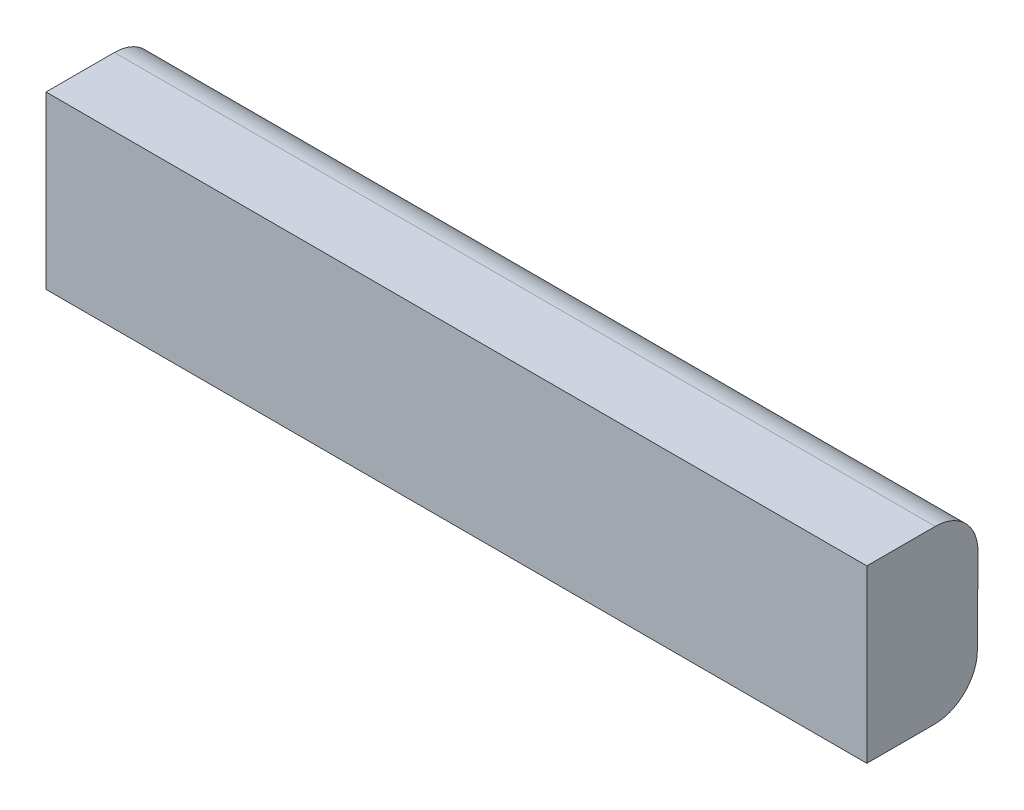
ISO-10303-21;
HEADER;
FILE_DESCRIPTION(('STEP AP214'),'2;1');
FILE_NAME('part.step','',(''),(''),'','','');
FILE_SCHEMA(('AUTOMOTIVE_DESIGN { 1 0 10303 214 1 1 1 1 }'));
ENDSEC;
DATA;
#1=APPLICATION_CONTEXT('core data for automotive mechanical design processes');
#2=APPLICATION_PROTOCOL_DEFINITION('international standard','automotive_design',2000,#1);
#3=PRODUCT_CONTEXT('',#1,'mechanical');
#4=PRODUCT('Part','Part','',(#3));
#5=PRODUCT_RELATED_PRODUCT_CATEGORY('part','',(#4));
#6=PRODUCT_DEFINITION_FORMATION('','',#4);
#7=PRODUCT_DEFINITION_CONTEXT('part definition',#1,'design');
#8=PRODUCT_DEFINITION('design','',#6,#7);
#9=PRODUCT_DEFINITION_SHAPE('','',#8);
#10=(LENGTH_UNIT() NAMED_UNIT(*) SI_UNIT(.MILLI.,.METRE.));
#11=(NAMED_UNIT(*) PLANE_ANGLE_UNIT() SI_UNIT($,.RADIAN.));
#12=(NAMED_UNIT(*) SI_UNIT($,.STERADIAN.) SOLID_ANGLE_UNIT());
#13=UNCERTAINTY_MEASURE_WITH_UNIT(LENGTH_MEASURE(1.E-05),#10,'distance_accuracy_value','');
#14=(GEOMETRIC_REPRESENTATION_CONTEXT(3) GLOBAL_UNCERTAINTY_ASSIGNED_CONTEXT((#13)) GLOBAL_UNIT_ASSIGNED_CONTEXT((#10,
#11,#12)) REPRESENTATION_CONTEXT('',''));
#15=CARTESIAN_POINT('',(0.,0.,0.));
#16=DIRECTION('',(0.,0.,1.));
#17=DIRECTION('',(1.,0.,0.));
#18=AXIS2_PLACEMENT_3D('',#15,#16,#17);
#19=CARTESIAN_POINT('',(609.6,-11.0704388992199,17.6191479273626));
#20=DIRECTION('',(-1.,0.,0.));
#21=DIRECTION('',(0.,0.,1.));
#22=AXIS2_PLACEMENT_3D('',#19,#20,#21);
#23=CYLINDRICAL_SURFACE('',#22,31.75);
#24=CARTESIAN_POINT('',(0.,-11.0704388992199,17.6191479273626));
#25=DIRECTION('',(1.,0.,0.));
#26=DIRECTION('',(0.,0.,-1.));
#27=AXIS2_PLACEMENT_3D('',#24,#25,#26);
#28=CIRCLE('',#27,31.75);
#29=CARTESIAN_POINT('',(0.,-42.8204388992199,17.6191479273626));
#30=VERTEX_POINT('',#29);
#31=CARTESIAN_POINT('',(0.,-11.0704388992199,-14.1308520726374));
#32=VERTEX_POINT('',#31);
#33=EDGE_CURVE('E128',#30,#32,#28,.T.);
#34=ORIENTED_EDGE('',*,*,#33,.T.);
#35=DIRECTION('',(-1.,0.,0.));
#36=VECTOR('',#35,1.);
#37=CARTESIAN_POINT('',(609.6,-11.0704388992199,-14.1308520726374));
#38=LINE('',#37,#36);
#39=CARTESIAN_POINT('',(609.6,-11.0704388992199,-14.1308520726374));
#40=VERTEX_POINT('',#39);
#41=EDGE_CURVE('E11',#40,#32,#38,.T.);
#42=ORIENTED_EDGE('',*,*,#41,.F.);
#43=CARTESIAN_POINT('',(609.6,-11.0704388992199,17.6191479273626));
#44=DIRECTION('',(1.,0.,0.));
#45=DIRECTION('',(0.,0.,-1.));
#46=AXIS2_PLACEMENT_3D('',#43,#44,#45);
#47=CIRCLE('',#46,31.75);
#48=CARTESIAN_POINT('',(609.6,-42.8204388992199,17.6191479273626));
#49=VERTEX_POINT('',#48);
#50=EDGE_CURVE('E144',#49,#40,#47,.T.);
#51=ORIENTED_EDGE('',*,*,#50,.F.);
#52=DIRECTION('',(-1.,0.,0.));
#53=VECTOR('',#52,1.);
#54=CARTESIAN_POINT('',(609.6,-42.8204388992199,17.6191479273626));
#55=LINE('',#54,#53);
#56=EDGE_CURVE('E124',#49,#30,#55,.T.);
#57=ORIENTED_EDGE('',*,*,#56,.T.);
#58=EDGE_LOOP('',(#34,#42,#51,#57));
#59=FACE_BOUND('',#58,.T.);
#60=ADVANCED_FACE('F39',(#59),#23,.T.);
#61=CARTESIAN_POINT('',(609.6,52.4295611007801,-14.6077024444965));
#62=DIRECTION('',(0.,0.00750924294765673,0.999971805237704));
#63=DIRECTION('',(0.,-0.999971805237704,0.00750924294765673));
#64=AXIS2_PLACEMENT_3D('',#61,#62,#63);
#65=PLANE('',#64);
#66=DIRECTION('',(0.,0.999971805237704,-0.00750924294765673));
#67=VECTOR('',#66,1.);
#68=CARTESIAN_POINT('',(0.,52.4295611007801,-14.6077024444965));
#69=LINE('',#68,#67);
#70=CARTESIAN_POINT('',(0.,52.4295611007801,-14.6077024444965));
#71=VERTEX_POINT('',#70);
#72=EDGE_CURVE('E132',#32,#71,#69,.T.);
#73=ORIENTED_EDGE('',*,*,#72,.T.);
#74=DIRECTION('',(-1.,0.,0.));
#75=VECTOR('',#74,1.);
#76=CARTESIAN_POINT('',(609.6,52.4295611007801,-14.6077024444965));
#77=LINE('',#76,#75);
#78=CARTESIAN_POINT('',(609.6,52.4295611007801,-14.6077024444965));
#79=VERTEX_POINT('',#78);
#80=EDGE_CURVE('E48',#79,#71,#77,.T.);
#81=ORIENTED_EDGE('',*,*,#80,.F.);
#82=DIRECTION('',(0.,0.999971805237704,-0.00750924294765673));
#83=VECTOR('',#82,1.);
#84=CARTESIAN_POINT('',(609.6,52.4295611007801,-14.6077024444965));
#85=LINE('',#84,#83);
#86=EDGE_CURVE('E93',#40,#79,#85,.T.);
#87=ORIENTED_EDGE('',*,*,#86,.F.);
#88=ORIENTED_EDGE('',*,*,#41,.T.);
#89=EDGE_LOOP('',(#73,#81,#87,#88));
#90=FACE_BOUND('',#89,.T.);
#91=ADVANCED_FACE('F172',(#90),#65,.F.);
#92=CARTESIAN_POINT('',(609.6,52.4295611007801,17.1422975555035));
#93=DIRECTION('',(-1.,0.,0.));
#94=DIRECTION('',(0.,0.,1.));
#95=AXIS2_PLACEMENT_3D('',#92,#93,#94);
#96=CYLINDRICAL_SURFACE('',#95,31.75);
#97=CARTESIAN_POINT('',(0.,52.4295611007801,17.1422975555035));
#98=DIRECTION('',(1.,0.,0.));
#99=DIRECTION('',(0.,0.,1.));
#100=AXIS2_PLACEMENT_3D('',#97,#98,#99);
#101=CIRCLE('',#100,31.75);
#102=CARTESIAN_POINT('',(0.,84.1795611007801,17.1422975555035));
#103=VERTEX_POINT('',#102);
#104=EDGE_CURVE('E135',#71,#103,#101,.T.);
#105=ORIENTED_EDGE('',*,*,#104,.T.);
#106=DIRECTION('',(-1.,0.,0.));
#107=VECTOR('',#106,1.);
#108=CARTESIAN_POINT('',(609.6,84.1795611007801,17.1422975555035));
#109=LINE('',#108,#107);
#110=CARTESIAN_POINT('',(609.6,84.1795611007801,17.1422975555035));
#111=VERTEX_POINT('',#110);
#112=EDGE_CURVE('E117',#111,#103,#109,.T.);
#113=ORIENTED_EDGE('',*,*,#112,.F.);
#114=CARTESIAN_POINT('',(609.6,52.4295611007801,17.1422975555035));
#115=DIRECTION('',(1.,0.,0.));
#116=DIRECTION('',(0.,0.,1.));
#117=AXIS2_PLACEMENT_3D('',#114,#115,#116);
#118=CIRCLE('',#117,31.75);
#119=EDGE_CURVE('E106',#79,#111,#118,.T.);
#120=ORIENTED_EDGE('',*,*,#119,.F.);
#121=ORIENTED_EDGE('',*,*,#80,.T.);
#122=EDGE_LOOP('',(#105,#113,#120,#121));
#123=FACE_BOUND('',#122,.T.);
#124=ADVANCED_FACE('F154',(#123),#96,.T.);
#125=CARTESIAN_POINT('',(609.6,84.1795611007801,17.1422975555035));
#126=DIRECTION('',(0.,-1.,0.));
#127=DIRECTION('',(0.,0.,-1.));
#128=AXIS2_PLACEMENT_3D('',#125,#126,#127);
#129=PLANE('',#128);
#130=DIRECTION('',(0.,0.,1.));
#131=VECTOR('',#130,1.);
#132=CARTESIAN_POINT('',(0.,84.1795611007801,17.1422975555035));
#133=LINE('',#132,#131);
#134=CARTESIAN_POINT('',(0.,84.1795611007801,67.9422975555035));
#135=VERTEX_POINT('',#134);
#136=EDGE_CURVE('E115',#103,#135,#133,.T.);
#137=ORIENTED_EDGE('',*,*,#136,.T.);
#138=DIRECTION('',(-1.,0.,0.));
#139=VECTOR('',#138,1.);
#140=CARTESIAN_POINT('',(609.6,84.1795611007801,67.9422975555035));
#141=LINE('',#140,#139);
#142=CARTESIAN_POINT('',(609.6,84.1795611007801,67.9422975555035));
#143=VERTEX_POINT('',#142);
#144=EDGE_CURVE('E112',#143,#135,#141,.T.);
#145=ORIENTED_EDGE('',*,*,#144,.F.);
#146=DIRECTION('',(0.,0.,1.));
#147=VECTOR('',#146,1.);
#148=CARTESIAN_POINT('',(609.6,84.1795611007801,17.1422975555035));
#149=LINE('',#148,#147);
#150=EDGE_CURVE('E100',#111,#143,#149,.T.);
#151=ORIENTED_EDGE('',*,*,#150,.F.);
#152=ORIENTED_EDGE('',*,*,#112,.T.);
#153=EDGE_LOOP('',(#137,#145,#151,#152));
#154=FACE_BOUND('',#153,.T.);
#155=ADVANCED_FACE('F113',(#154),#129,.F.);
#156=CARTESIAN_POINT('',(609.6,-42.8204388992199,67.9422975555035));
#157=DIRECTION('',(0.,0.,-1.));
#158=DIRECTION('',(0.,1.,0.));
#159=AXIS2_PLACEMENT_3D('',#156,#157,#158);
#160=PLANE('',#159);
#161=DIRECTION('',(0.,-1.,0.));
#162=VECTOR('',#161,1.);
#163=CARTESIAN_POINT('',(0.,-42.8204388992199,67.9422975555035));
#164=LINE('',#163,#162);
#165=CARTESIAN_POINT('',(0.,-42.8204388992199,67.9422975555035));
#166=VERTEX_POINT('',#165);
#167=EDGE_CURVE('E79',#135,#166,#164,.T.);
#168=ORIENTED_EDGE('',*,*,#167,.T.);
#169=DIRECTION('',(-1.,0.,0.));
#170=VECTOR('',#169,1.);
#171=CARTESIAN_POINT('',(609.6,-42.8204388992199,67.9422975555035));
#172=LINE('',#171,#170);
#173=CARTESIAN_POINT('',(609.6,-42.8204388992199,67.9422975555035));
#174=VERTEX_POINT('',#173);
#175=EDGE_CURVE('E118',#174,#166,#172,.T.);
#176=ORIENTED_EDGE('',*,*,#175,.F.);
#177=DIRECTION('',(0.,-1.,0.));
#178=VECTOR('',#177,1.);
#179=CARTESIAN_POINT('',(609.6,-42.8204388992199,67.9422975555035));
#180=LINE('',#179,#178);
#181=EDGE_CURVE('E104',#143,#174,#180,.T.);
#182=ORIENTED_EDGE('',*,*,#181,.F.);
#183=ORIENTED_EDGE('',*,*,#144,.T.);
#184=EDGE_LOOP('',(#168,#176,#182,#183));
#185=FACE_BOUND('',#184,.T.);
#186=ADVANCED_FACE('F120',(#185),#160,.F.);
#187=CARTESIAN_POINT('',(609.6,-42.8204388992199,67.9422975555035));
#188=DIRECTION('',(0.,1.,0.));
#189=DIRECTION('',(0.,0.,1.));
#190=AXIS2_PLACEMENT_3D('',#187,#188,#189);
#191=PLANE('',#190);
#192=DIRECTION('',(0.,0.,-1.));
#193=VECTOR('',#192,1.);
#194=CARTESIAN_POINT('',(0.,-42.8204388992199,67.9422975555035));
#195=LINE('',#194,#193);
#196=EDGE_CURVE('E85',#166,#30,#195,.T.);
#197=ORIENTED_EDGE('',*,*,#196,.T.);
#198=ORIENTED_EDGE('',*,*,#56,.F.);
#199=DIRECTION('',(0.,0.,-1.));
#200=VECTOR('',#199,1.);
#201=CARTESIAN_POINT('',(609.6,-42.8204388992199,67.9422975555035));
#202=LINE('',#201,#200);
#203=EDGE_CURVE('E56',#174,#49,#202,.T.);
#204=ORIENTED_EDGE('',*,*,#203,.F.);
#205=ORIENTED_EDGE('',*,*,#175,.T.);
#206=EDGE_LOOP('',(#197,#198,#204,#205));
#207=FACE_BOUND('',#206,.T.);
#208=ADVANCED_FACE('F161',(#207),#191,.F.);
#209=CARTESIAN_POINT('',(609.6,-11.0704388992199,17.6191479273626));
#210=DIRECTION('',(1.,0.,0.));
#211=DIRECTION('',(0.,0.,-1.));
#212=AXIS2_PLACEMENT_3D('',#209,#210,#211);
#213=PLANE('',#212);
#214=ORIENTED_EDGE('',*,*,#50,.T.);
#215=ORIENTED_EDGE('',*,*,#86,.T.);
#216=ORIENTED_EDGE('',*,*,#119,.T.);
#217=ORIENTED_EDGE('',*,*,#150,.T.);
#218=ORIENTED_EDGE('',*,*,#181,.T.);
#219=ORIENTED_EDGE('',*,*,#203,.T.);
#220=EDGE_LOOP('',(#214,#215,#216,#217,#218,#219));
#221=FACE_BOUND('',#220,.T.);
#222=ADVANCED_FACE('F102',(#221),#213,.T.);
#223=CARTESIAN_POINT('',(0.,-11.0704388992199,17.6191479273626));
#224=DIRECTION('',(1.,0.,0.));
#225=DIRECTION('',(0.,0.,-1.));
#226=AXIS2_PLACEMENT_3D('',#223,#224,#225);
#227=PLANE('',#226);
#228=ORIENTED_EDGE('',*,*,#33,.F.);
#229=ORIENTED_EDGE('',*,*,#196,.F.);
#230=ORIENTED_EDGE('',*,*,#167,.F.);
#231=ORIENTED_EDGE('',*,*,#136,.F.);
#232=ORIENTED_EDGE('',*,*,#104,.F.);
#233=ORIENTED_EDGE('',*,*,#72,.F.);
#234=EDGE_LOOP('',(#228,#229,#230,#231,#232,#233));
#235=FACE_BOUND('',#234,.T.);
#236=ADVANCED_FACE('F157',(#235),#227,.F.);
#237=CLOSED_SHELL('',(#60,#91,#124,#155,#186,#208,#222,#236));
#238=MANIFOLD_SOLID_BREP('B2',#237);
#239=ADVANCED_BREP_SHAPE_REPRESENTATION('',(#18,#238),#14);
#240=SHAPE_DEFINITION_REPRESENTATION(#9,#239);
ENDSEC;
END-ISO-10303-21;
